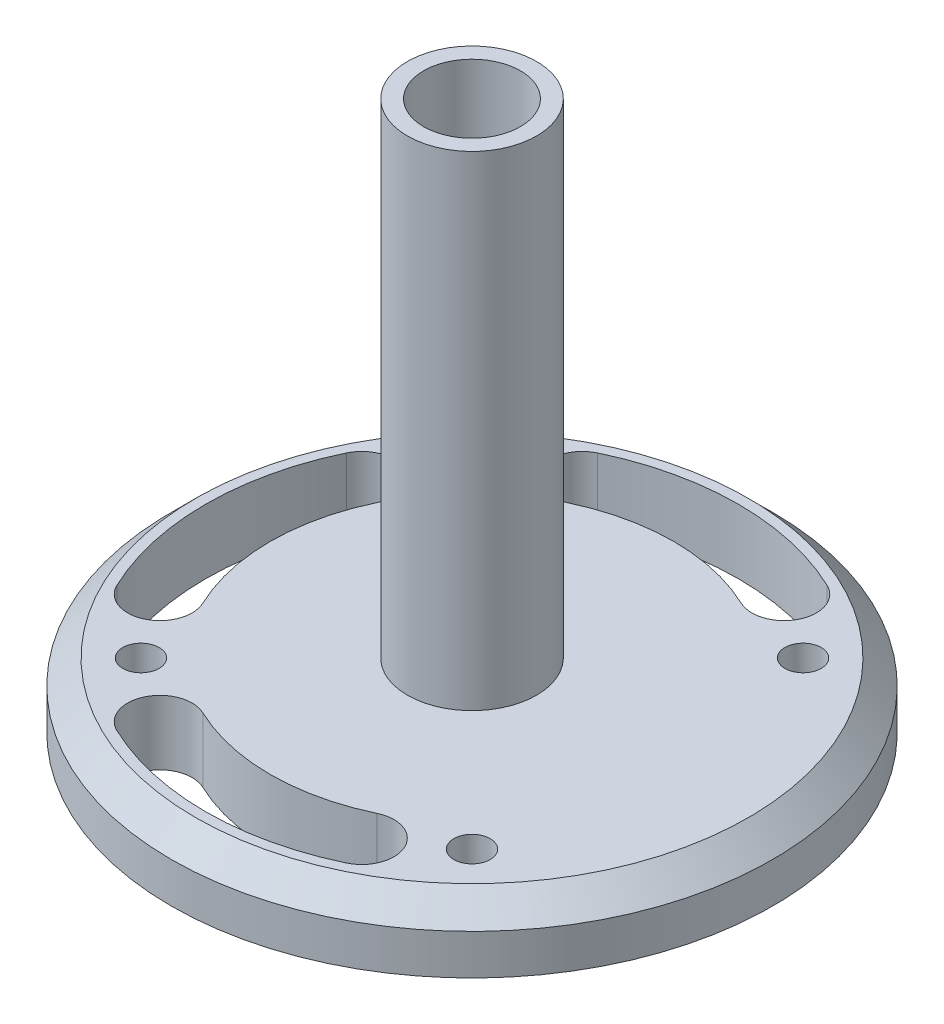
ISO-10303-21;
HEADER;
FILE_DESCRIPTION(('STEP AP214'),'2;1');
FILE_NAME('part.step','',(''),(''),'','','');
FILE_SCHEMA(('AUTOMOTIVE_DESIGN { 1 0 10303 214 1 1 1 1 }'));
ENDSEC;
DATA;
#1=APPLICATION_CONTEXT('core data for automotive mechanical design processes');
#2=APPLICATION_PROTOCOL_DEFINITION('international standard','automotive_design',2000,#1);
#3=PRODUCT_CONTEXT('',#1,'mechanical');
#4=PRODUCT('Part','Part','',(#3));
#5=PRODUCT_RELATED_PRODUCT_CATEGORY('part','',(#4));
#6=PRODUCT_DEFINITION_FORMATION('','',#4);
#7=PRODUCT_DEFINITION_CONTEXT('part definition',#1,'design');
#8=PRODUCT_DEFINITION('design','',#6,#7);
#9=PRODUCT_DEFINITION_SHAPE('','',#8);
#10=(LENGTH_UNIT() NAMED_UNIT(*) SI_UNIT(.MILLI.,.METRE.));
#11=(NAMED_UNIT(*) PLANE_ANGLE_UNIT() SI_UNIT($,.RADIAN.));
#12=(NAMED_UNIT(*) SI_UNIT($,.STERADIAN.) SOLID_ANGLE_UNIT());
#13=UNCERTAINTY_MEASURE_WITH_UNIT(LENGTH_MEASURE(1.E-05),#10,'distance_accuracy_value','');
#14=(GEOMETRIC_REPRESENTATION_CONTEXT(3) GLOBAL_UNCERTAINTY_ASSIGNED_CONTEXT((#13)) GLOBAL_UNIT_ASSIGNED_CONTEXT((#10,
#11,#12)) REPRESENTATION_CONTEXT('',''));
#15=CARTESIAN_POINT('',(0.,0.,0.));
#16=DIRECTION('',(0.,0.,1.));
#17=DIRECTION('',(1.,0.,0.));
#18=AXIS2_PLACEMENT_3D('',#15,#16,#17);
#19=CARTESIAN_POINT('',(0.,8.,0.));
#20=DIRECTION('',(0.,-1.,0.));
#21=DIRECTION('',(0.,0.,-1.));
#22=AXIS2_PLACEMENT_3D('',#19,#20,#21);
#23=CYLINDRICAL_SURFACE('',#22,37.25);
#24=CARTESIAN_POINT('',(0.,4.99999999999998,0.));
#25=DIRECTION('',(0.,1.,0.));
#26=DIRECTION('',(0.,0.,1.));
#27=AXIS2_PLACEMENT_3D('',#24,#25,#26);
#28=CIRCLE('',#27,37.25);
#29=CARTESIAN_POINT('',(0.,4.99999999999998,37.25));
#30=VERTEX_POINT('',#29);
#31=EDGE_CURVE('E12',#30,#30,#28,.F.);
#32=ORIENTED_EDGE('',*,*,#31,.T.);
#33=EDGE_LOOP('',(#32));
#34=FACE_BOUND('',#33,.T.);
#35=CARTESIAN_POINT('',(0.,0.,0.));
#36=DIRECTION('',(0.,1.,0.));
#37=DIRECTION('',(0.,0.,1.));
#38=AXIS2_PLACEMENT_3D('',#35,#36,#37);
#39=CIRCLE('',#38,37.25);
#40=CARTESIAN_POINT('',(0.,0.,37.25));
#41=VERTEX_POINT('',#40);
#42=EDGE_CURVE('E254',#41,#41,#39,.T.);
#43=ORIENTED_EDGE('',*,*,#42,.T.);
#44=EDGE_LOOP('',(#43));
#45=FACE_BOUND('',#44,.T.);
#46=ADVANCED_FACE('F44',(#34,#45),#23,.T.);
#47=CARTESIAN_POINT('',(0.,8.,0.));
#48=DIRECTION('',(0.,1.,0.));
#49=DIRECTION('',(0.,0.,1.));
#50=AXIS2_PLACEMENT_3D('',#47,#48,#49);
#51=PLANE('',#50);
#52=CARTESIAN_POINT('',(-26.1677282162591,8.,12.5));
#53=DIRECTION('',(0.,1.,0.));
#54=DIRECTION('',(0.,0.,1.));
#55=AXIS2_PLACEMENT_3D('',#52,#53,#54);
#56=CIRCLE('',#55,4.);
#57=CARTESIAN_POINT('',(-29.7770700391913,8.,14.2241379310345));
#58=VERTEX_POINT('',#57);
#59=CARTESIAN_POINT('',(-22.5583863933268,8.,10.7758620689655));
#60=VERTEX_POINT('',#59);
#61=EDGE_CURVE('E142',#58,#60,#56,.T.);
#62=ORIENTED_EDGE('',*,*,#61,.F.);
#63=CARTESIAN_POINT('',(1.56125112837913E-13,8.,0.));
#64=DIRECTION('',(0.,1.,0.));
#65=DIRECTION('',(0.,0.,1.));
#66=AXIS2_PLACEMENT_3D('',#63,#64,#65);
#67=CIRCLE('',#66,33.0000000000001);
#68=CARTESIAN_POINT('',(-29.7770700391913,8.,-14.2241379310345));
#69=VERTEX_POINT('',#68);
#70=EDGE_CURVE('E240',#69,#58,#67,.T.);
#71=ORIENTED_EDGE('',*,*,#70,.F.);
#72=CARTESIAN_POINT('',(-26.1677282162591,8.,-12.5));
#73=DIRECTION('',(0.,1.,0.));
#74=DIRECTION('',(0.,0.,1.));
#75=AXIS2_PLACEMENT_3D('',#72,#73,#74);
#76=CIRCLE('',#75,4.);
#77=CARTESIAN_POINT('',(-22.5583863933268,8.,-10.7758620689655));
#78=VERTEX_POINT('',#77);
#79=EDGE_CURVE('E242',#78,#69,#76,.T.);
#80=ORIENTED_EDGE('',*,*,#79,.F.);
#81=CARTESIAN_POINT('',(1.56125112837913E-13,8.,0.));
#82=DIRECTION('',(0.,1.,0.));
#83=DIRECTION('',(0.,0.,1.));
#84=AXIS2_PLACEMENT_3D('',#81,#82,#83);
#85=CIRCLE('',#84,25.0000000000001);
#86=EDGE_CURVE('E244',#78,#60,#85,.T.);
#87=ORIENTED_EDGE('',*,*,#86,.T.);
#88=EDGE_LOOP('',(#62,#71,#80,#87));
#89=FACE_BOUND('',#88,.T.);
#90=CARTESIAN_POINT('',(-12.5000000000003,8.,-26.1677282162589));
#91=DIRECTION('',(0.,1.,0.));
#92=DIRECTION('',(0.,0.,1.));
#93=AXIS2_PLACEMENT_3D('',#90,#91,#92);
#94=CIRCLE('',#93,4.);
#95=CARTESIAN_POINT('',(-14.2241379310345,8.,-29.7770700391913));
#96=VERTEX_POINT('',#95);
#97=CARTESIAN_POINT('',(-10.7758620689655,8.,-22.5583863933267));
#98=VERTEX_POINT('',#97);
#99=EDGE_CURVE('E238',#96,#98,#94,.T.);
#100=ORIENTED_EDGE('',*,*,#99,.F.);
#101=CARTESIAN_POINT('',(1.56125112837913E-13,8.,0.));
#102=DIRECTION('',(0.,1.,0.));
#103=DIRECTION('',(0.,0.,1.));
#104=AXIS2_PLACEMENT_3D('',#101,#102,#103);
#105=CIRCLE('',#104,33.);
#106=CARTESIAN_POINT('',(14.2241379310345,8.,-29.7770700391914));
#107=VERTEX_POINT('',#106);
#108=EDGE_CURVE('E231',#107,#96,#105,.T.);
#109=ORIENTED_EDGE('',*,*,#108,.F.);
#110=CARTESIAN_POINT('',(12.4999999999997,8.,-26.1677282162592));
#111=DIRECTION('',(0.,1.,0.));
#112=DIRECTION('',(0.,0.,1.));
#113=AXIS2_PLACEMENT_3D('',#110,#111,#112);
#114=CIRCLE('',#113,4.);
#115=CARTESIAN_POINT('',(10.7758620689656,8.,-22.5583863933268));
#116=VERTEX_POINT('',#115);
#117=EDGE_CURVE('E233',#116,#107,#114,.T.);
#118=ORIENTED_EDGE('',*,*,#117,.F.);
#119=CARTESIAN_POINT('',(1.56125112837913E-13,8.,0.));
#120=DIRECTION('',(0.,1.,0.));
#121=DIRECTION('',(0.,0.,1.));
#122=AXIS2_PLACEMENT_3D('',#119,#120,#121);
#123=CIRCLE('',#122,25.);
#124=EDGE_CURVE('E235',#116,#98,#123,.T.);
#125=ORIENTED_EDGE('',*,*,#124,.T.);
#126=EDGE_LOOP('',(#100,#109,#118,#125));
#127=FACE_BOUND('',#126,.T.);
#128=CARTESIAN_POINT('',(-20.506096654411,8.,20.5060966544098));
#129=DIRECTION('',(0.,1.,0.));
#130=DIRECTION('',(0.,0.,1.));
#131=AXIS2_PLACEMENT_3D('',#128,#129,#130);
#132=CIRCLE('',#131,2.25);
#133=CARTESIAN_POINT('',(-20.506096654411,8.,22.7560966544098));
#134=VERTEX_POINT('',#133);
#135=EDGE_CURVE('E228',#134,#134,#132,.T.);
#136=ORIENTED_EDGE('',*,*,#135,.F.);
#137=EDGE_LOOP('',(#136));
#138=FACE_BOUND('',#137,.T.);
#139=CARTESIAN_POINT('',(20.5060966544087,8.,20.506096654411));
#140=DIRECTION('',(0.,1.,0.));
#141=DIRECTION('',(0.,0.,1.));
#142=AXIS2_PLACEMENT_3D('',#139,#140,#141);
#143=CIRCLE('',#142,2.25);
#144=CARTESIAN_POINT('',(20.5060966544087,8.,22.756096654411));
#145=VERTEX_POINT('',#144);
#146=EDGE_CURVE('E225',#145,#145,#143,.T.);
#147=ORIENTED_EDGE('',*,*,#146,.F.);
#148=EDGE_LOOP('',(#147));
#149=FACE_BOUND('',#148,.T.);
#150=CARTESIAN_POINT('',(20.5060966544099,8.,-20.5060966544087));
#151=DIRECTION('',(0.,1.,0.));
#152=DIRECTION('',(0.,0.,1.));
#153=AXIS2_PLACEMENT_3D('',#150,#151,#152);
#154=CIRCLE('',#153,2.25);
#155=CARTESIAN_POINT('',(20.5060966544099,8.,-18.2560966544087));
#156=VERTEX_POINT('',#155);
#157=EDGE_CURVE('E222',#156,#156,#154,.T.);
#158=ORIENTED_EDGE('',*,*,#157,.F.);
#159=EDGE_LOOP('',(#158));
#160=FACE_BOUND('',#159,.T.);
#161=CARTESIAN_POINT('',(-20.5060966544098,8.,-20.5060966544099));
#162=DIRECTION('',(0.,1.,0.));
#163=DIRECTION('',(0.,0.,1.));
#164=AXIS2_PLACEMENT_3D('',#161,#162,#163);
#165=CIRCLE('',#164,2.25);
#166=CARTESIAN_POINT('',(-20.5060966544098,8.,-18.2560966544099));
#167=VERTEX_POINT('',#166);
#168=EDGE_CURVE('E219',#167,#167,#165,.T.);
#169=ORIENTED_EDGE('',*,*,#168,.F.);
#170=EDGE_LOOP('',(#169));
#171=FACE_BOUND('',#170,.T.);
#172=CARTESIAN_POINT('',(1.56125112837913E-13,8.,0.));
#173=DIRECTION('',(0.,1.,0.));
#174=DIRECTION('',(0.,0.,1.));
#175=AXIS2_PLACEMENT_3D('',#172,#173,#174);
#176=CIRCLE('',#175,33.);
#177=CARTESIAN_POINT('',(-14.2241379310345,8.,29.7770700391913));
#178=VERTEX_POINT('',#177);
#179=CARTESIAN_POINT('',(14.2241379310345,8.,29.7770700391914));
#180=VERTEX_POINT('',#179);
#181=EDGE_CURVE('E217',#178,#180,#176,.T.);
#182=ORIENTED_EDGE('',*,*,#181,.F.);
#183=CARTESIAN_POINT('',(-12.4999999999999,8.,26.1677282162591));
#184=DIRECTION('',(0.,1.,0.));
#185=DIRECTION('',(0.,0.,1.));
#186=AXIS2_PLACEMENT_3D('',#183,#184,#185);
#187=CIRCLE('',#186,4.);
#188=CARTESIAN_POINT('',(-10.7758620689655,8.,22.5583863933268));
#189=VERTEX_POINT('',#188);
#190=EDGE_CURVE('E204',#189,#178,#187,.T.);
#191=ORIENTED_EDGE('',*,*,#190,.F.);
#192=CARTESIAN_POINT('',(1.56125112837913E-13,8.,0.));
#193=DIRECTION('',(0.,1.,0.));
#194=DIRECTION('',(0.,0.,1.));
#195=AXIS2_PLACEMENT_3D('',#192,#193,#194);
#196=CIRCLE('',#195,25.);
#197=CARTESIAN_POINT('',(10.7758620689656,8.,22.5583863933268));
#198=VERTEX_POINT('',#197);
#199=EDGE_CURVE('E212',#189,#198,#196,.T.);
#200=ORIENTED_EDGE('',*,*,#199,.T.);
#201=CARTESIAN_POINT('',(12.5000000000001,8.,26.167728216259));
#202=DIRECTION('',(0.,1.,0.));
#203=DIRECTION('',(0.,0.,1.));
#204=AXIS2_PLACEMENT_3D('',#201,#202,#203);
#205=CIRCLE('',#204,4.);
#206=EDGE_CURVE('E215',#180,#198,#205,.T.);
#207=ORIENTED_EDGE('',*,*,#206,.F.);
#208=EDGE_LOOP('',(#182,#191,#200,#207));
#209=FACE_BOUND('',#208,.T.);
#210=CARTESIAN_POINT('',(0.,8.,0.));
#211=DIRECTION('',(0.,1.,0.));
#212=DIRECTION('',(0.,0.,1.));
#213=AXIS2_PLACEMENT_3D('',#210,#211,#212);
#214=CIRCLE('',#213,34.25);
#215=CARTESIAN_POINT('',(0.,8.,34.25));
#216=VERTEX_POINT('',#215);
#217=EDGE_CURVE('E54',#216,#216,#214,.T.);
#218=ORIENTED_EDGE('',*,*,#217,.T.);
#219=EDGE_LOOP('',(#218));
#220=FACE_BOUND('',#219,.T.);
#221=CARTESIAN_POINT('',(0.,8.,0.));
#222=DIRECTION('',(0.,1.,0.));
#223=DIRECTION('',(0.,0.,1.));
#224=AXIS2_PLACEMENT_3D('',#221,#222,#223);
#225=CIRCLE('',#224,8.);
#226=CARTESIAN_POINT('',(0.,8.,8.));
#227=VERTEX_POINT('',#226);
#228=EDGE_CURVE('E250',#227,#227,#225,.T.);
#229=ORIENTED_EDGE('',*,*,#228,.F.);
#230=EDGE_LOOP('',(#229));
#231=FACE_BOUND('',#230,.T.);
#232=ADVANCED_FACE('F262',(#89,#127,#138,#149,#160,#171,#209,#220,#231),#51,.T.);
#233=CARTESIAN_POINT('',(0.,0.,0.));
#234=DIRECTION('',(0.,1.,0.));
#235=DIRECTION('',(0.,0.,1.));
#236=AXIS2_PLACEMENT_3D('',#233,#234,#235);
#237=PLANE('',#236);
#238=CARTESIAN_POINT('',(1.56125112837913E-13,0.,0.));
#239=DIRECTION('',(0.,-1.,0.));
#240=DIRECTION('',(0.,0.,-1.));
#241=AXIS2_PLACEMENT_3D('',#238,#239,#240);
#242=CIRCLE('',#241,33.0000000000001);
#243=CARTESIAN_POINT('',(-29.7770700391913,0.,14.2241379310345));
#244=VERTEX_POINT('',#243);
#245=CARTESIAN_POINT('',(-29.7770700391913,0.,-14.2241379310345));
#246=VERTEX_POINT('',#245);
#247=EDGE_CURVE('E161',#244,#246,#242,.T.);
#248=ORIENTED_EDGE('',*,*,#247,.F.);
#249=CARTESIAN_POINT('',(-26.1677282162591,0.,12.5));
#250=DIRECTION('',(0.,-1.,0.));
#251=DIRECTION('',(0.,0.,-1.));
#252=AXIS2_PLACEMENT_3D('',#249,#250,#251);
#253=CIRCLE('',#252,4.);
#254=CARTESIAN_POINT('',(-22.5583863933268,0.,10.7758620689655));
#255=VERTEX_POINT('',#254);
#256=EDGE_CURVE('E139',#255,#244,#253,.T.);
#257=ORIENTED_EDGE('',*,*,#256,.F.);
#258=CARTESIAN_POINT('',(1.56125112837913E-13,0.,0.));
#259=DIRECTION('',(0.,-1.,0.));
#260=DIRECTION('',(0.,0.,-1.));
#261=AXIS2_PLACEMENT_3D('',#258,#259,#260);
#262=CIRCLE('',#261,25.0000000000001);
#263=CARTESIAN_POINT('',(-22.5583863933268,0.,-10.7758620689655));
#264=VERTEX_POINT('',#263);
#265=EDGE_CURVE('E149',#255,#264,#262,.T.);
#266=ORIENTED_EDGE('',*,*,#265,.T.);
#267=CARTESIAN_POINT('',(-26.1677282162591,0.,-12.5));
#268=DIRECTION('',(0.,-1.,0.));
#269=DIRECTION('',(0.,0.,-1.));
#270=AXIS2_PLACEMENT_3D('',#267,#268,#269);
#271=CIRCLE('',#270,4.);
#272=EDGE_CURVE('E155',#246,#264,#271,.T.);
#273=ORIENTED_EDGE('',*,*,#272,.F.);
#274=EDGE_LOOP('',(#248,#257,#266,#273));
#275=FACE_BOUND('',#274,.T.);
#276=CARTESIAN_POINT('',(1.56125112837913E-13,0.,0.));
#277=DIRECTION('',(0.,-1.,0.));
#278=DIRECTION('',(0.,0.,-1.));
#279=AXIS2_PLACEMENT_3D('',#276,#277,#278);
#280=CIRCLE('',#279,33.);
#281=CARTESIAN_POINT('',(-14.2241379310345,0.,-29.7770700391913));
#282=VERTEX_POINT('',#281);
#283=CARTESIAN_POINT('',(14.2241379310345,0.,-29.7770700391914));
#284=VERTEX_POINT('',#283);
#285=EDGE_CURVE('E184',#282,#284,#280,.T.);
#286=ORIENTED_EDGE('',*,*,#285,.F.);
#287=CARTESIAN_POINT('',(-12.5000000000003,0.,-26.1677282162589));
#288=DIRECTION('',(0.,-1.,0.));
#289=DIRECTION('',(0.,0.,-1.));
#290=AXIS2_PLACEMENT_3D('',#287,#288,#289);
#291=CIRCLE('',#290,4.);
#292=CARTESIAN_POINT('',(-10.7758620689655,0.,-22.5583863933267));
#293=VERTEX_POINT('',#292);
#294=EDGE_CURVE('E146',#293,#282,#291,.T.);
#295=ORIENTED_EDGE('',*,*,#294,.F.);
#296=CARTESIAN_POINT('',(1.56125112837913E-13,0.,0.));
#297=DIRECTION('',(0.,-1.,0.));
#298=DIRECTION('',(0.,0.,-1.));
#299=AXIS2_PLACEMENT_3D('',#296,#297,#298);
#300=CIRCLE('',#299,25.);
#301=CARTESIAN_POINT('',(10.7758620689656,0.,-22.5583863933268));
#302=VERTEX_POINT('',#301);
#303=EDGE_CURVE('E172',#293,#302,#300,.T.);
#304=ORIENTED_EDGE('',*,*,#303,.T.);
#305=CARTESIAN_POINT('',(12.4999999999997,0.,-26.1677282162592));
#306=DIRECTION('',(0.,-1.,0.));
#307=DIRECTION('',(0.,0.,-1.));
#308=AXIS2_PLACEMENT_3D('',#305,#306,#307);
#309=CIRCLE('',#308,4.);
#310=EDGE_CURVE('E181',#284,#302,#309,.T.);
#311=ORIENTED_EDGE('',*,*,#310,.F.);
#312=EDGE_LOOP('',(#286,#295,#304,#311));
#313=FACE_BOUND('',#312,.T.);
#314=CARTESIAN_POINT('',(-20.506096654411,0.,20.5060966544098));
#315=DIRECTION('',(0.,-1.,0.));
#316=DIRECTION('',(0.,0.,-1.));
#317=AXIS2_PLACEMENT_3D('',#314,#315,#316);
#318=CIRCLE('',#317,2.25);
#319=CARTESIAN_POINT('',(-20.506096654411,0.,18.2560966544098));
#320=VERTEX_POINT('',#319);
#321=EDGE_CURVE('E178',#320,#320,#318,.T.);
#322=ORIENTED_EDGE('',*,*,#321,.F.);
#323=EDGE_LOOP('',(#322));
#324=FACE_BOUND('',#323,.T.);
#325=CARTESIAN_POINT('',(20.5060966544087,0.,20.506096654411));
#326=DIRECTION('',(0.,-1.,0.));
#327=DIRECTION('',(0.,0.,-1.));
#328=AXIS2_PLACEMENT_3D('',#325,#326,#327);
#329=CIRCLE('',#328,2.25);
#330=CARTESIAN_POINT('',(20.5060966544087,0.,18.256096654411));
#331=VERTEX_POINT('',#330);
#332=EDGE_CURVE('E189',#331,#331,#329,.T.);
#333=ORIENTED_EDGE('',*,*,#332,.F.);
#334=EDGE_LOOP('',(#333));
#335=FACE_BOUND('',#334,.T.);
#336=CARTESIAN_POINT('',(20.5060966544099,0.,-20.5060966544087));
#337=DIRECTION('',(0.,-1.,0.));
#338=DIRECTION('',(0.,0.,-1.));
#339=AXIS2_PLACEMENT_3D('',#336,#337,#338);
#340=CIRCLE('',#339,2.25);
#341=CARTESIAN_POINT('',(20.5060966544099,0.,-22.7560966544087));
#342=VERTEX_POINT('',#341);
#343=EDGE_CURVE('E191',#342,#342,#340,.T.);
#344=ORIENTED_EDGE('',*,*,#343,.F.);
#345=EDGE_LOOP('',(#344));
#346=FACE_BOUND('',#345,.T.);
#347=CARTESIAN_POINT('',(-20.5060966544098,0.,-20.5060966544099));
#348=DIRECTION('',(0.,-1.,0.));
#349=DIRECTION('',(0.,0.,-1.));
#350=AXIS2_PLACEMENT_3D('',#347,#348,#349);
#351=CIRCLE('',#350,2.25);
#352=CARTESIAN_POINT('',(-20.5060966544098,0.,-22.7560966544099));
#353=VERTEX_POINT('',#352);
#354=EDGE_CURVE('E357',#353,#353,#351,.T.);
#355=ORIENTED_EDGE('',*,*,#354,.F.);
#356=EDGE_LOOP('',(#355));
#357=FACE_BOUND('',#356,.T.);
#358=CARTESIAN_POINT('',(-12.4999999999999,0.,26.1677282162591));
#359=DIRECTION('',(0.,-1.,0.));
#360=DIRECTION('',(0.,0.,-1.));
#361=AXIS2_PLACEMENT_3D('',#358,#359,#360);
#362=CIRCLE('',#361,4.);
#363=CARTESIAN_POINT('',(-14.2241379310345,0.,29.7770700391913));
#364=VERTEX_POINT('',#363);
#365=CARTESIAN_POINT('',(-10.7758620689655,0.,22.5583863933267));
#366=VERTEX_POINT('',#365);
#367=EDGE_CURVE('E164',#364,#366,#362,.T.);
#368=ORIENTED_EDGE('',*,*,#367,.F.);
#369=CARTESIAN_POINT('',(1.56125112837913E-13,0.,0.));
#370=DIRECTION('',(0.,-1.,0.));
#371=DIRECTION('',(0.,0.,-1.));
#372=AXIS2_PLACEMENT_3D('',#369,#370,#371);
#373=CIRCLE('',#372,33.);
#374=CARTESIAN_POINT('',(14.2241379310345,0.,29.7770700391914));
#375=VERTEX_POINT('',#374);
#376=EDGE_CURVE('E162',#375,#364,#373,.T.);
#377=ORIENTED_EDGE('',*,*,#376,.F.);
#378=CARTESIAN_POINT('',(12.5000000000001,0.,26.167728216259));
#379=DIRECTION('',(0.,-1.,0.));
#380=DIRECTION('',(0.,0.,-1.));
#381=AXIS2_PLACEMENT_3D('',#378,#379,#380);
#382=CIRCLE('',#381,4.);
#383=CARTESIAN_POINT('',(10.7758620689656,0.,22.5583863933268));
#384=VERTEX_POINT('',#383);
#385=EDGE_CURVE('E198',#384,#375,#382,.T.);
#386=ORIENTED_EDGE('',*,*,#385,.F.);
#387=CARTESIAN_POINT('',(1.56125112837913E-13,0.,0.));
#388=DIRECTION('',(0.,-1.,0.));
#389=DIRECTION('',(0.,0.,-1.));
#390=AXIS2_PLACEMENT_3D('',#387,#388,#389);
#391=CIRCLE('',#390,25.);
#392=EDGE_CURVE('E195',#384,#366,#391,.T.);
#393=ORIENTED_EDGE('',*,*,#392,.T.);
#394=EDGE_LOOP('',(#368,#377,#386,#393));
#395=FACE_BOUND('',#394,.T.);
#396=CARTESIAN_POINT('',(0.,0.,0.));
#397=DIRECTION('',(0.,1.,0.));
#398=DIRECTION('',(0.,0.,1.));
#399=AXIS2_PLACEMENT_3D('',#396,#397,#398);
#400=CIRCLE('',#399,6.);
#401=CARTESIAN_POINT('',(0.,0.,6.));
#402=VERTEX_POINT('',#401);
#403=EDGE_CURVE('E49',#402,#402,#400,.T.);
#404=ORIENTED_EDGE('',*,*,#403,.T.);
#405=EDGE_LOOP('',(#404));
#406=FACE_BOUND('',#405,.T.);
#407=ORIENTED_EDGE('',*,*,#42,.F.);
#408=EDGE_LOOP('',(#407));
#409=FACE_BOUND('',#408,.T.);
#410=ADVANCED_FACE('F159',(#275,#313,#324,#335,#346,#357,#395,#406,#409),#237,.F.);
#411=CARTESIAN_POINT('',(0.,68.,0.));
#412=DIRECTION('',(0.,1.,0.));
#413=DIRECTION('',(0.,0.,1.));
#414=AXIS2_PLACEMENT_3D('',#411,#412,#413);
#415=PLANE('',#414);
#416=CARTESIAN_POINT('',(0.,68.,0.));
#417=DIRECTION('',(0.,1.,0.));
#418=DIRECTION('',(0.,0.,1.));
#419=AXIS2_PLACEMENT_3D('',#416,#417,#418);
#420=CIRCLE('',#419,8.);
#421=CARTESIAN_POINT('',(0.,68.,8.));
#422=VERTEX_POINT('',#421);
#423=EDGE_CURVE('E251',#422,#422,#420,.T.);
#424=ORIENTED_EDGE('',*,*,#423,.T.);
#425=EDGE_LOOP('',(#424));
#426=FACE_BOUND('',#425,.T.);
#427=CARTESIAN_POINT('',(0.,68.,0.));
#428=DIRECTION('',(0.,1.,0.));
#429=DIRECTION('',(0.,0.,1.));
#430=AXIS2_PLACEMENT_3D('',#427,#428,#429);
#431=CIRCLE('',#430,6.);
#432=CARTESIAN_POINT('',(0.,68.,6.));
#433=VERTEX_POINT('',#432);
#434=EDGE_CURVE('E247',#433,#433,#431,.T.);
#435=ORIENTED_EDGE('',*,*,#434,.F.);
#436=EDGE_LOOP('',(#435));
#437=FACE_BOUND('',#436,.T.);
#438=ADVANCED_FACE('F290',(#426,#437),#415,.T.);
#439=CARTESIAN_POINT('',(0.,68.,0.));
#440=DIRECTION('',(0.,-1.,0.));
#441=DIRECTION('',(0.,0.,-1.));
#442=AXIS2_PLACEMENT_3D('',#439,#440,#441);
#443=CYLINDRICAL_SURFACE('',#442,8.);
#444=ORIENTED_EDGE('',*,*,#423,.F.);
#445=EDGE_LOOP('',(#444));
#446=FACE_BOUND('',#445,.T.);
#447=ORIENTED_EDGE('',*,*,#228,.T.);
#448=EDGE_LOOP('',(#447));
#449=FACE_BOUND('',#448,.T.);
#450=ADVANCED_FACE('F276',(#446,#449),#443,.T.);
#451=CARTESIAN_POINT('',(0.,68.,0.));
#452=DIRECTION('',(0.,-1.,0.));
#453=DIRECTION('',(0.,0.,-1.));
#454=AXIS2_PLACEMENT_3D('',#451,#452,#453);
#455=CYLINDRICAL_SURFACE('',#454,6.);
#456=ORIENTED_EDGE('',*,*,#434,.T.);
#457=EDGE_LOOP('',(#456));
#458=FACE_BOUND('',#457,.T.);
#459=ORIENTED_EDGE('',*,*,#403,.F.);
#460=EDGE_LOOP('',(#459));
#461=FACE_BOUND('',#460,.T.);
#462=ADVANCED_FACE('F267',(#458,#461),#455,.F.);
#463=CARTESIAN_POINT('',(0.,8.,0.));
#464=DIRECTION('',(0.,-1.,0.));
#465=DIRECTION('',(0.,0.,-1.));
#466=AXIS2_PLACEMENT_3D('',#463,#464,#465);
#467=CONICAL_SURFACE('',#466,34.25,0.785398163397443);
#468=ORIENTED_EDGE('',*,*,#31,.F.);
#469=EDGE_LOOP('',(#468));
#470=FACE_BOUND('',#469,.T.);
#471=ORIENTED_EDGE('',*,*,#217,.F.);
#472=EDGE_LOOP('',(#471));
#473=FACE_BOUND('',#472,.T.);
#474=ADVANCED_FACE('F47',(#470,#473),#467,.T.);
#475=CARTESIAN_POINT('',(1.56125112837913E-13,10.,0.));
#476=DIRECTION('',(0.,-1.,0.));
#477=DIRECTION('',(0.,0.,-1.));
#478=AXIS2_PLACEMENT_3D('',#475,#476,#477);
#479=CYLINDRICAL_SURFACE('',#478,33.);
#480=ORIENTED_EDGE('',*,*,#181,.T.);
#481=DIRECTION('',(0.,-1.,0.));
#482=VECTOR('',#481,1.);
#483=CARTESIAN_POINT('',(14.2241379310345,10.,29.7770700391914));
#484=LINE('',#483,#482);
#485=EDGE_CURVE('E202',#180,#375,#484,.T.);
#486=ORIENTED_EDGE('',*,*,#485,.T.);
#487=ORIENTED_EDGE('',*,*,#376,.T.);
#488=DIRECTION('',(0.,-1.,0.));
#489=VECTOR('',#488,1.);
#490=CARTESIAN_POINT('',(-14.2241379310345,10.,29.7770700391913));
#491=LINE('',#490,#489);
#492=EDGE_CURVE('E201',#178,#364,#491,.T.);
#493=ORIENTED_EDGE('',*,*,#492,.F.);
#494=EDGE_LOOP('',(#480,#486,#487,#493));
#495=FACE_BOUND('',#494,.T.);
#496=ADVANCED_FACE('F266',(#495),#479,.F.);
#497=CARTESIAN_POINT('',(12.5000000000001,10.,26.167728216259));
#498=DIRECTION('',(0.,-1.,0.));
#499=DIRECTION('',(0.,0.,-1.));
#500=AXIS2_PLACEMENT_3D('',#497,#498,#499);
#501=CYLINDRICAL_SURFACE('',#500,4.);
#502=ORIENTED_EDGE('',*,*,#206,.T.);
#503=DIRECTION('',(0.,-1.,0.));
#504=VECTOR('',#503,1.);
#505=CARTESIAN_POINT('',(10.7758620689656,10.,22.5583863933268));
#506=LINE('',#505,#504);
#507=EDGE_CURVE('E205',#198,#384,#506,.T.);
#508=ORIENTED_EDGE('',*,*,#507,.T.);
#509=ORIENTED_EDGE('',*,*,#385,.T.);
#510=ORIENTED_EDGE('',*,*,#485,.F.);
#511=EDGE_LOOP('',(#502,#508,#509,#510));
#512=FACE_BOUND('',#511,.T.);
#513=ADVANCED_FACE('F273',(#512),#501,.F.);
#514=CARTESIAN_POINT('',(1.56125112837913E-13,10.,0.));
#515=DIRECTION('',(0.,-1.,0.));
#516=DIRECTION('',(0.,0.,-1.));
#517=AXIS2_PLACEMENT_3D('',#514,#515,#516);
#518=CYLINDRICAL_SURFACE('',#517,25.);
#519=DIRECTION('',(0.,-1.,0.));
#520=VECTOR('',#519,1.);
#521=CARTESIAN_POINT('',(-10.7758620689655,10.,22.5583863933267));
#522=LINE('',#521,#520);
#523=EDGE_CURVE('E207',#189,#366,#522,.T.);
#524=ORIENTED_EDGE('',*,*,#523,.T.);
#525=ORIENTED_EDGE('',*,*,#392,.F.);
#526=ORIENTED_EDGE('',*,*,#507,.F.);
#527=ORIENTED_EDGE('',*,*,#199,.F.);
#528=EDGE_LOOP('',(#524,#525,#526,#527));
#529=FACE_BOUND('',#528,.T.);
#530=ADVANCED_FACE('F302',(#529),#518,.T.);
#531=CARTESIAN_POINT('',(-12.4999999999999,10.,26.1677282162591));
#532=DIRECTION('',(0.,-1.,0.));
#533=DIRECTION('',(0.,0.,-1.));
#534=AXIS2_PLACEMENT_3D('',#531,#532,#533);
#535=CYLINDRICAL_SURFACE('',#534,4.);
#536=ORIENTED_EDGE('',*,*,#190,.T.);
#537=ORIENTED_EDGE('',*,*,#492,.T.);
#538=ORIENTED_EDGE('',*,*,#367,.T.);
#539=ORIENTED_EDGE('',*,*,#523,.F.);
#540=EDGE_LOOP('',(#536,#537,#538,#539));
#541=FACE_BOUND('',#540,.T.);
#542=ADVANCED_FACE('F298',(#541),#535,.F.);
#543=CARTESIAN_POINT('',(-20.5060966544098,10.,-20.5060966544099));
#544=DIRECTION('',(0.,-1.,0.));
#545=DIRECTION('',(0.,0.,-1.));
#546=AXIS2_PLACEMENT_3D('',#543,#544,#545);
#547=CYLINDRICAL_SURFACE('',#546,2.25);
#548=ORIENTED_EDGE('',*,*,#168,.T.);
#549=EDGE_LOOP('',(#548));
#550=FACE_BOUND('',#549,.T.);
#551=ORIENTED_EDGE('',*,*,#354,.T.);
#552=EDGE_LOOP('',(#551));
#553=FACE_BOUND('',#552,.T.);
#554=ADVANCED_FACE('F301',(#550,#553),#547,.F.);
#555=CARTESIAN_POINT('',(20.5060966544099,10.,-20.5060966544087));
#556=DIRECTION('',(0.,-1.,0.));
#557=DIRECTION('',(0.,0.,-1.));
#558=AXIS2_PLACEMENT_3D('',#555,#556,#557);
#559=CYLINDRICAL_SURFACE('',#558,2.25);
#560=ORIENTED_EDGE('',*,*,#157,.T.);
#561=EDGE_LOOP('',(#560));
#562=FACE_BOUND('',#561,.T.);
#563=ORIENTED_EDGE('',*,*,#343,.T.);
#564=EDGE_LOOP('',(#563));
#565=FACE_BOUND('',#564,.T.);
#566=ADVANCED_FACE('F314',(#562,#565),#559,.F.);
#567=CARTESIAN_POINT('',(20.5060966544087,10.,20.506096654411));
#568=DIRECTION('',(0.,-1.,0.));
#569=DIRECTION('',(0.,0.,-1.));
#570=AXIS2_PLACEMENT_3D('',#567,#568,#569);
#571=CYLINDRICAL_SURFACE('',#570,2.25);
#572=ORIENTED_EDGE('',*,*,#146,.T.);
#573=EDGE_LOOP('',(#572));
#574=FACE_BOUND('',#573,.T.);
#575=ORIENTED_EDGE('',*,*,#332,.T.);
#576=EDGE_LOOP('',(#575));
#577=FACE_BOUND('',#576,.T.);
#578=ADVANCED_FACE('F310',(#574,#577),#571,.F.);
#579=CARTESIAN_POINT('',(-20.506096654411,10.,20.5060966544098));
#580=DIRECTION('',(0.,-1.,0.));
#581=DIRECTION('',(0.,0.,-1.));
#582=AXIS2_PLACEMENT_3D('',#579,#580,#581);
#583=CYLINDRICAL_SURFACE('',#582,2.25);
#584=ORIENTED_EDGE('',*,*,#135,.T.);
#585=EDGE_LOOP('',(#584));
#586=FACE_BOUND('',#585,.T.);
#587=ORIENTED_EDGE('',*,*,#321,.T.);
#588=EDGE_LOOP('',(#587));
#589=FACE_BOUND('',#588,.T.);
#590=ADVANCED_FACE('F313',(#586,#589),#583,.F.);
#591=CARTESIAN_POINT('',(-12.5000000000003,10.,-26.1677282162589));
#592=DIRECTION('',(0.,-1.,0.));
#593=DIRECTION('',(0.,0.,-1.));
#594=AXIS2_PLACEMENT_3D('',#591,#592,#593);
#595=CYLINDRICAL_SURFACE('',#594,4.);
#596=ORIENTED_EDGE('',*,*,#99,.T.);
#597=DIRECTION('',(0.,-1.,0.));
#598=VECTOR('',#597,1.);
#599=CARTESIAN_POINT('',(-10.7758620689655,10.,-22.5583863933267));
#600=LINE('',#599,#598);
#601=EDGE_CURVE('E176',#98,#293,#600,.T.);
#602=ORIENTED_EDGE('',*,*,#601,.T.);
#603=ORIENTED_EDGE('',*,*,#294,.T.);
#604=DIRECTION('',(0.,-1.,0.));
#605=VECTOR('',#604,1.);
#606=CARTESIAN_POINT('',(-14.2241379310345,10.,-29.7770700391913));
#607=LINE('',#606,#605);
#608=EDGE_CURVE('E169',#96,#282,#607,.T.);
#609=ORIENTED_EDGE('',*,*,#608,.F.);
#610=EDGE_LOOP('',(#596,#602,#603,#609));
#611=FACE_BOUND('',#610,.T.);
#612=ADVANCED_FACE('F318',(#611),#595,.F.);
#613=CARTESIAN_POINT('',(1.56125112837913E-13,10.,0.));
#614=DIRECTION('',(0.,-1.,0.));
#615=DIRECTION('',(0.,0.,-1.));
#616=AXIS2_PLACEMENT_3D('',#613,#614,#615);
#617=CYLINDRICAL_SURFACE('',#616,25.);
#618=DIRECTION('',(0.,-1.,0.));
#619=VECTOR('',#618,1.);
#620=CARTESIAN_POINT('',(10.7758620689656,10.,-22.5583863933268));
#621=LINE('',#620,#619);
#622=EDGE_CURVE('E174',#116,#302,#621,.T.);
#623=ORIENTED_EDGE('',*,*,#622,.T.);
#624=ORIENTED_EDGE('',*,*,#303,.F.);
#625=ORIENTED_EDGE('',*,*,#601,.F.);
#626=ORIENTED_EDGE('',*,*,#124,.F.);
#627=EDGE_LOOP('',(#623,#624,#625,#626));
#628=FACE_BOUND('',#627,.T.);
#629=ADVANCED_FACE('F320',(#628),#617,.T.);
#630=CARTESIAN_POINT('',(12.4999999999997,10.,-26.1677282162592));
#631=DIRECTION('',(0.,-1.,0.));
#632=DIRECTION('',(0.,0.,-1.));
#633=AXIS2_PLACEMENT_3D('',#630,#631,#632);
#634=CYLINDRICAL_SURFACE('',#633,4.);
#635=ORIENTED_EDGE('',*,*,#117,.T.);
#636=DIRECTION('',(0.,-1.,0.));
#637=VECTOR('',#636,1.);
#638=CARTESIAN_POINT('',(14.2241379310345,10.,-29.7770700391914));
#639=LINE('',#638,#637);
#640=EDGE_CURVE('E69',#107,#284,#639,.T.);
#641=ORIENTED_EDGE('',*,*,#640,.T.);
#642=ORIENTED_EDGE('',*,*,#310,.T.);
#643=ORIENTED_EDGE('',*,*,#622,.F.);
#644=EDGE_LOOP('',(#635,#641,#642,#643));
#645=FACE_BOUND('',#644,.T.);
#646=ADVANCED_FACE('F323',(#645),#634,.F.);
#647=CARTESIAN_POINT('',(1.56125112837913E-13,10.,0.));
#648=DIRECTION('',(0.,-1.,0.));
#649=DIRECTION('',(0.,0.,-1.));
#650=AXIS2_PLACEMENT_3D('',#647,#648,#649);
#651=CYLINDRICAL_SURFACE('',#650,33.);
#652=ORIENTED_EDGE('',*,*,#108,.T.);
#653=ORIENTED_EDGE('',*,*,#608,.T.);
#654=ORIENTED_EDGE('',*,*,#285,.T.);
#655=ORIENTED_EDGE('',*,*,#640,.F.);
#656=EDGE_LOOP('',(#652,#653,#654,#655));
#657=FACE_BOUND('',#656,.T.);
#658=ADVANCED_FACE('F327',(#657),#651,.F.);
#659=CARTESIAN_POINT('',(-26.1677282162591,10.,12.5));
#660=DIRECTION('',(0.,-1.,0.));
#661=DIRECTION('',(0.,0.,-1.));
#662=AXIS2_PLACEMENT_3D('',#659,#660,#661);
#663=CYLINDRICAL_SURFACE('',#662,4.);
#664=ORIENTED_EDGE('',*,*,#61,.T.);
#665=DIRECTION('',(0.,-1.,0.));
#666=VECTOR('',#665,1.);
#667=CARTESIAN_POINT('',(-22.5583863933268,10.,10.7758620689655));
#668=LINE('',#667,#666);
#669=EDGE_CURVE('E134',#60,#255,#668,.T.);
#670=ORIENTED_EDGE('',*,*,#669,.T.);
#671=ORIENTED_EDGE('',*,*,#256,.T.);
#672=DIRECTION('',(0.,-1.,0.));
#673=VECTOR('',#672,1.);
#674=CARTESIAN_POINT('',(-29.7770700391913,10.,14.2241379310345));
#675=LINE('',#674,#673);
#676=EDGE_CURVE('E156',#58,#244,#675,.T.);
#677=ORIENTED_EDGE('',*,*,#676,.F.);
#678=EDGE_LOOP('',(#664,#670,#671,#677));
#679=FACE_BOUND('',#678,.T.);
#680=ADVANCED_FACE('F136',(#679),#663,.F.);
#681=CARTESIAN_POINT('',(1.56125112837913E-13,10.,0.));
#682=DIRECTION('',(0.,-1.,0.));
#683=DIRECTION('',(0.,0.,-1.));
#684=AXIS2_PLACEMENT_3D('',#681,#682,#683);
#685=CYLINDRICAL_SURFACE('',#684,25.0000000000001);
#686=DIRECTION('',(0.,-1.,0.));
#687=VECTOR('',#686,1.);
#688=CARTESIAN_POINT('',(-22.5583863933268,10.,-10.7758620689655));
#689=LINE('',#688,#687);
#690=EDGE_CURVE('E145',#78,#264,#689,.T.);
#691=ORIENTED_EDGE('',*,*,#690,.T.);
#692=ORIENTED_EDGE('',*,*,#265,.F.);
#693=ORIENTED_EDGE('',*,*,#669,.F.);
#694=ORIENTED_EDGE('',*,*,#86,.F.);
#695=EDGE_LOOP('',(#691,#692,#693,#694));
#696=FACE_BOUND('',#695,.T.);
#697=ADVANCED_FACE('F150',(#696),#685,.T.);
#698=CARTESIAN_POINT('',(-26.1677282162591,10.,-12.5));
#699=DIRECTION('',(0.,-1.,0.));
#700=DIRECTION('',(0.,0.,-1.));
#701=AXIS2_PLACEMENT_3D('',#698,#699,#700);
#702=CYLINDRICAL_SURFACE('',#701,4.);
#703=ORIENTED_EDGE('',*,*,#79,.T.);
#704=DIRECTION('',(0.,-1.,0.));
#705=VECTOR('',#704,1.);
#706=CARTESIAN_POINT('',(-29.7770700391913,10.,-14.2241379310345));
#707=LINE('',#706,#705);
#708=EDGE_CURVE('E61',#69,#246,#707,.T.);
#709=ORIENTED_EDGE('',*,*,#708,.T.);
#710=ORIENTED_EDGE('',*,*,#272,.T.);
#711=ORIENTED_EDGE('',*,*,#690,.F.);
#712=EDGE_LOOP('',(#703,#709,#710,#711));
#713=FACE_BOUND('',#712,.T.);
#714=ADVANCED_FACE('F336',(#713),#702,.F.);
#715=CARTESIAN_POINT('',(1.56125112837913E-13,10.,0.));
#716=DIRECTION('',(0.,-1.,0.));
#717=DIRECTION('',(0.,0.,-1.));
#718=AXIS2_PLACEMENT_3D('',#715,#716,#717);
#719=CYLINDRICAL_SURFACE('',#718,33.0000000000001);
#720=ORIENTED_EDGE('',*,*,#70,.T.);
#721=ORIENTED_EDGE('',*,*,#676,.T.);
#722=ORIENTED_EDGE('',*,*,#247,.T.);
#723=ORIENTED_EDGE('',*,*,#708,.F.);
#724=EDGE_LOOP('',(#720,#721,#722,#723));
#725=FACE_BOUND('',#724,.T.);
#726=ADVANCED_FACE('F339',(#725),#719,.F.);
#727=CLOSED_SHELL('',(#46,#232,#410,#438,#450,#462,#474,#496,#513,#530,#542,#554,#566,#578,#590,
#612,#629,#646,#658,#680,#697,#714,#726));
#728=MANIFOLD_SOLID_BREP('B2',#727);
#729=ADVANCED_BREP_SHAPE_REPRESENTATION('',(#18,#728),#14);
#730=SHAPE_DEFINITION_REPRESENTATION(#9,#729);
ENDSEC;
END-ISO-10303-21;
